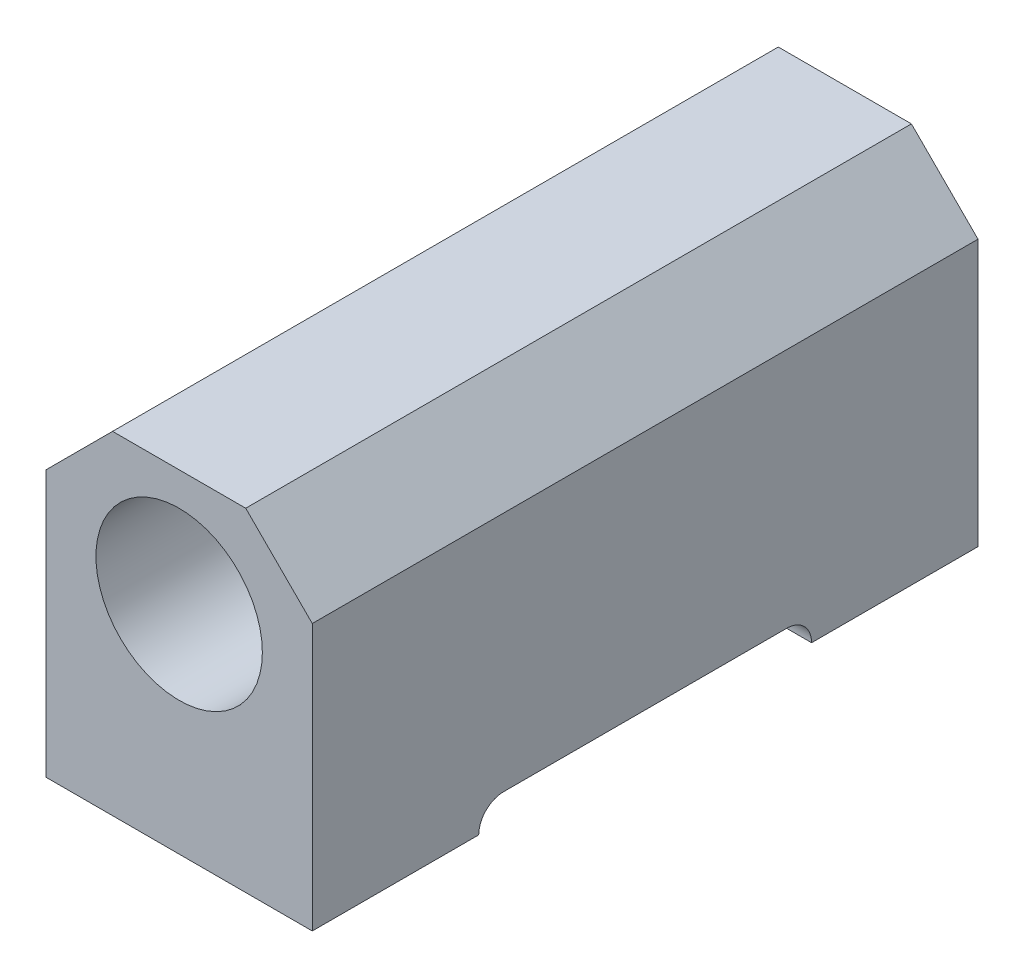
ISO-10303-21;
HEADER;
FILE_DESCRIPTION(('STEP AP214'),'2;1');
FILE_NAME('part.step','',(''),(''),'','','');
FILE_SCHEMA(('AUTOMOTIVE_DESIGN { 1 0 10303 214 1 1 1 1 }'));
ENDSEC;
DATA;
#1=APPLICATION_CONTEXT('core data for automotive mechanical design processes');
#2=APPLICATION_PROTOCOL_DEFINITION('international standard','automotive_design',2000,#1);
#3=PRODUCT_CONTEXT('',#1,'mechanical');
#4=PRODUCT('Part','Part','',(#3));
#5=PRODUCT_RELATED_PRODUCT_CATEGORY('part','',(#4));
#6=PRODUCT_DEFINITION_FORMATION('','',#4);
#7=PRODUCT_DEFINITION_CONTEXT('part definition',#1,'design');
#8=PRODUCT_DEFINITION('design','',#6,#7);
#9=PRODUCT_DEFINITION_SHAPE('','',#8);
#10=(LENGTH_UNIT() NAMED_UNIT(*) SI_UNIT(.MILLI.,.METRE.));
#11=(NAMED_UNIT(*) PLANE_ANGLE_UNIT() SI_UNIT($,.RADIAN.));
#12=(NAMED_UNIT(*) SI_UNIT($,.STERADIAN.) SOLID_ANGLE_UNIT());
#13=UNCERTAINTY_MEASURE_WITH_UNIT(LENGTH_MEASURE(1.E-05),#10,'distance_accuracy_value','');
#14=(GEOMETRIC_REPRESENTATION_CONTEXT(3) GLOBAL_UNCERTAINTY_ASSIGNED_CONTEXT((#13)) GLOBAL_UNIT_ASSIGNED_CONTEXT((#10,
#11,#12)) REPRESENTATION_CONTEXT('',''));
#15=CARTESIAN_POINT('',(0.,0.,0.));
#16=DIRECTION('',(0.,0.,1.));
#17=DIRECTION('',(1.,0.,0.));
#18=AXIS2_PLACEMENT_3D('',#15,#16,#17);
#19=CARTESIAN_POINT('',(-16.,0.,80.));
#20=DIRECTION('',(0.,1.,0.));
#21=DIRECTION('',(0.,0.,1.));
#22=AXIS2_PLACEMENT_3D('',#19,#20,#21);
#23=PLANE('',#22);
#24=DIRECTION('',(0.,0.,-1.));
#25=VECTOR('',#24,1.);
#26=CARTESIAN_POINT('',(-16.,0.,80.));
#27=LINE('',#26,#25);
#28=CARTESIAN_POINT('',(-16.,0.,80.));
#29=VERTEX_POINT('',#28);
#30=CARTESIAN_POINT('',(-16.,0.,60.));
#31=VERTEX_POINT('',#30);
#32=EDGE_CURVE('E11',#29,#31,#27,.T.);
#33=ORIENTED_EDGE('',*,*,#32,.T.);
#34=DIRECTION('',(1.,0.,0.));
#35=VECTOR('',#34,1.);
#36=CARTESIAN_POINT('',(-16.,0.,60.));
#37=LINE('',#36,#35);
#38=CARTESIAN_POINT('',(16.,0.,60.));
#39=VERTEX_POINT('',#38);
#40=EDGE_CURVE('E147',#31,#39,#37,.T.);
#41=ORIENTED_EDGE('',*,*,#40,.T.);
#42=DIRECTION('',(0.,0.,-1.));
#43=VECTOR('',#42,1.);
#44=CARTESIAN_POINT('',(16.,0.,80.));
#45=LINE('',#44,#43);
#46=CARTESIAN_POINT('',(16.,0.,80.));
#47=VERTEX_POINT('',#46);
#48=EDGE_CURVE('E194',#47,#39,#45,.T.);
#49=ORIENTED_EDGE('',*,*,#48,.F.);
#50=DIRECTION('',(1.,0.,0.));
#51=VECTOR('',#50,1.);
#52=CARTESIAN_POINT('',(-16.,0.,80.));
#53=LINE('',#52,#51);
#54=EDGE_CURVE('E159',#29,#47,#53,.T.);
#55=ORIENTED_EDGE('',*,*,#54,.F.);
#56=EDGE_LOOP('',(#33,#41,#49,#55));
#57=FACE_BOUND('',#56,.T.);
#58=ADVANCED_FACE('F33',(#57),#23,.F.);
#59=CARTESIAN_POINT('',(-16.,32.,80.));
#60=DIRECTION('',(1.,0.,0.));
#61=DIRECTION('',(0.,0.,-1.));
#62=AXIS2_PLACEMENT_3D('',#59,#60,#61);
#63=PLANE('',#62);
#64=DIRECTION('',(0.,0.,1.));
#65=VECTOR('',#64,1.);
#66=CARTESIAN_POINT('',(-16.,3.,57.));
#67=LINE('',#66,#65);
#68=CARTESIAN_POINT('',(-16.,3.,23.));
#69=VERTEX_POINT('',#68);
#70=CARTESIAN_POINT('',(-16.,3.,57.));
#71=VERTEX_POINT('',#70);
#72=EDGE_CURVE('E137',#69,#71,#67,.T.);
#73=ORIENTED_EDGE('',*,*,#72,.T.);
#74=CARTESIAN_POINT('',(-16.,0.,57.));
#75=DIRECTION('',(1.,0.,0.));
#76=DIRECTION('',(0.,0.,1.));
#77=AXIS2_PLACEMENT_3D('',#74,#75,#76);
#78=CIRCLE('',#77,3.);
#79=EDGE_CURVE('E141',#71,#31,#78,.T.);
#80=ORIENTED_EDGE('',*,*,#79,.T.);
#81=ORIENTED_EDGE('',*,*,#32,.F.);
#82=DIRECTION('',(0.,-1.,0.));
#83=VECTOR('',#82,1.);
#84=CARTESIAN_POINT('',(-16.,32.,80.));
#85=LINE('',#84,#83);
#86=CARTESIAN_POINT('',(-16.,32.,80.));
#87=VERTEX_POINT('',#86);
#88=EDGE_CURVE('E156',#87,#29,#85,.T.);
#89=ORIENTED_EDGE('',*,*,#88,.F.);
#90=DIRECTION('',(0.,0.,-1.));
#91=VECTOR('',#90,1.);
#92=CARTESIAN_POINT('',(-16.,32.,80.));
#93=LINE('',#92,#91);
#94=CARTESIAN_POINT('',(-16.,32.,0.));
#95=VERTEX_POINT('',#94);
#96=EDGE_CURVE('E170',#87,#95,#93,.T.);
#97=ORIENTED_EDGE('',*,*,#96,.T.);
#98=DIRECTION('',(0.,-1.,0.));
#99=VECTOR('',#98,1.);
#100=CARTESIAN_POINT('',(-16.,32.,0.));
#101=LINE('',#100,#99);
#102=CARTESIAN_POINT('',(-16.,0.,0.));
#103=VERTEX_POINT('',#102);
#104=EDGE_CURVE('E150',#95,#103,#101,.T.);
#105=ORIENTED_EDGE('',*,*,#104,.T.);
#106=CARTESIAN_POINT('',(-16.,0.,20.));
#107=VERTEX_POINT('',#106);
#108=EDGE_CURVE('E41',#107,#103,#27,.T.);
#109=ORIENTED_EDGE('',*,*,#108,.F.);
#110=CARTESIAN_POINT('',(-16.,0.,23.));
#111=DIRECTION('',(1.,0.,0.));
#112=DIRECTION('',(0.,0.,-1.));
#113=AXIS2_PLACEMENT_3D('',#110,#111,#112);
#114=CIRCLE('',#113,3.);
#115=EDGE_CURVE('E134',#107,#69,#114,.T.);
#116=ORIENTED_EDGE('',*,*,#115,.T.);
#117=EDGE_LOOP('',(#73,#80,#81,#89,#97,#105,#109,#116));
#118=FACE_BOUND('',#117,.T.);
#119=ADVANCED_FACE('F35',(#118),#63,.F.);
#120=CARTESIAN_POINT('',(0.,0.,10.));
#121=DIRECTION('',(0.,-1.,0.));
#122=DIRECTION('',(0.,0.,-1.));
#123=AXIS2_PLACEMENT_3D('',#120,#121,#122);
#124=CIRCLE('',#123,2.);
#125=CARTESIAN_POINT('',(0.,0.,8.));
#126=VERTEX_POINT('',#125);
#127=EDGE_CURVE('E257',#126,#126,#124,.T.);
#128=ORIENTED_EDGE('',*,*,#127,.F.);
#129=EDGE_LOOP('',(#128));
#130=FACE_BOUND('',#129,.T.);
#131=CARTESIAN_POINT('',(16.,0.,20.));
#132=VERTEX_POINT('',#131);
#133=CARTESIAN_POINT('',(16.,0.,0.));
#134=VERTEX_POINT('',#133);
#135=EDGE_CURVE('E193',#132,#134,#45,.T.);
#136=ORIENTED_EDGE('',*,*,#135,.F.);
#137=DIRECTION('',(1.,0.,0.));
#138=VECTOR('',#137,1.);
#139=CARTESIAN_POINT('',(-16.,0.,20.));
#140=LINE('',#139,#138);
#141=EDGE_CURVE('E53',#107,#132,#140,.T.);
#142=ORIENTED_EDGE('',*,*,#141,.F.);
#143=ORIENTED_EDGE('',*,*,#108,.T.);
#144=DIRECTION('',(1.,0.,0.));
#145=VECTOR('',#144,1.);
#146=CARTESIAN_POINT('',(-16.,0.,0.));
#147=LINE('',#146,#145);
#148=EDGE_CURVE('E173',#103,#134,#147,.T.);
#149=ORIENTED_EDGE('',*,*,#148,.T.);
#150=EDGE_LOOP('',(#136,#142,#143,#149));
#151=FACE_BOUND('',#150,.T.);
#152=ADVANCED_FACE('F207',(#130,#151),#23,.F.);
#153=CARTESIAN_POINT('',(16.,0.,80.));
#154=DIRECTION('',(-1.,0.,0.));
#155=DIRECTION('',(0.,0.,1.));
#156=AXIS2_PLACEMENT_3D('',#153,#154,#155);
#157=PLANE('',#156);
#158=ORIENTED_EDGE('',*,*,#48,.T.);
#159=CARTESIAN_POINT('',(16.,0.,57.));
#160=DIRECTION('',(1.,0.,0.));
#161=DIRECTION('',(0.,0.,1.));
#162=AXIS2_PLACEMENT_3D('',#159,#160,#161);
#163=CIRCLE('',#162,3.);
#164=CARTESIAN_POINT('',(16.,3.,57.));
#165=VERTEX_POINT('',#164);
#166=EDGE_CURVE('E138',#165,#39,#163,.T.);
#167=ORIENTED_EDGE('',*,*,#166,.F.);
#168=DIRECTION('',(0.,0.,1.));
#169=VECTOR('',#168,1.);
#170=CARTESIAN_POINT('',(16.,3.,57.));
#171=LINE('',#170,#169);
#172=CARTESIAN_POINT('',(16.,3.,23.));
#173=VERTEX_POINT('',#172);
#174=EDGE_CURVE('E127',#173,#165,#171,.T.);
#175=ORIENTED_EDGE('',*,*,#174,.F.);
#176=CARTESIAN_POINT('',(16.,0.,23.));
#177=DIRECTION('',(1.,0.,0.));
#178=DIRECTION('',(0.,0.,-1.));
#179=AXIS2_PLACEMENT_3D('',#176,#177,#178);
#180=CIRCLE('',#179,3.);
#181=EDGE_CURVE('E124',#132,#173,#180,.T.);
#182=ORIENTED_EDGE('',*,*,#181,.F.);
#183=ORIENTED_EDGE('',*,*,#135,.T.);
#184=DIRECTION('',(0.,1.,0.));
#185=VECTOR('',#184,1.);
#186=CARTESIAN_POINT('',(16.,0.,0.));
#187=LINE('',#186,#185);
#188=CARTESIAN_POINT('',(16.,32.,0.));
#189=VERTEX_POINT('',#188);
#190=EDGE_CURVE('E176',#134,#189,#187,.T.);
#191=ORIENTED_EDGE('',*,*,#190,.T.);
#192=DIRECTION('',(0.,0.,-1.));
#193=VECTOR('',#192,1.);
#194=CARTESIAN_POINT('',(16.,32.,80.));
#195=LINE('',#194,#193);
#196=CARTESIAN_POINT('',(16.,32.,80.));
#197=VERTEX_POINT('',#196);
#198=EDGE_CURVE('E191',#197,#189,#195,.T.);
#199=ORIENTED_EDGE('',*,*,#198,.F.);
#200=DIRECTION('',(0.,1.,0.));
#201=VECTOR('',#200,1.);
#202=CARTESIAN_POINT('',(16.,0.,80.));
#203=LINE('',#202,#201);
#204=EDGE_CURVE('E162',#47,#197,#203,.T.);
#205=ORIENTED_EDGE('',*,*,#204,.F.);
#206=EDGE_LOOP('',(#158,#167,#175,#182,#183,#191,#199,#205));
#207=FACE_BOUND('',#206,.T.);
#208=ADVANCED_FACE('F201',(#207),#157,.F.);
#209=CARTESIAN_POINT('',(16.,32.,80.));
#210=DIRECTION('',(-0.707106781186549,-0.707106781186546,0.));
#211=DIRECTION('',(0.707106781186546,-0.707106781186549,0.));
#212=AXIS2_PLACEMENT_3D('',#209,#210,#211);
#213=PLANE('',#212);
#214=DIRECTION('',(-0.707106781186546,0.707106781186549,0.));
#215=VECTOR('',#214,1.);
#216=CARTESIAN_POINT('',(16.,32.,0.));
#217=LINE('',#216,#215);
#218=CARTESIAN_POINT('',(8.00000000000003,40.,0.));
#219=VERTEX_POINT('',#218);
#220=EDGE_CURVE('E178',#189,#219,#217,.T.);
#221=ORIENTED_EDGE('',*,*,#220,.T.);
#222=DIRECTION('',(0.,0.,-1.));
#223=VECTOR('',#222,1.);
#224=CARTESIAN_POINT('',(8.00000000000003,40.,80.));
#225=LINE('',#224,#223);
#226=CARTESIAN_POINT('',(8.00000000000003,40.,80.));
#227=VERTEX_POINT('',#226);
#228=EDGE_CURVE('E188',#227,#219,#225,.T.);
#229=ORIENTED_EDGE('',*,*,#228,.F.);
#230=DIRECTION('',(-0.707106781186546,0.707106781186549,0.));
#231=VECTOR('',#230,1.);
#232=CARTESIAN_POINT('',(16.,32.,80.));
#233=LINE('',#232,#231);
#234=EDGE_CURVE('E164',#197,#227,#233,.T.);
#235=ORIENTED_EDGE('',*,*,#234,.F.);
#236=ORIENTED_EDGE('',*,*,#198,.T.);
#237=EDGE_LOOP('',(#221,#229,#235,#236));
#238=FACE_BOUND('',#237,.T.);
#239=ADVANCED_FACE('F217',(#238),#213,.F.);
#240=CARTESIAN_POINT('',(8.00000000000003,40.,80.));
#241=DIRECTION('',(0.,-1.,0.));
#242=DIRECTION('',(0.,0.,-1.));
#243=AXIS2_PLACEMENT_3D('',#240,#241,#242);
#244=PLANE('',#243);
#245=DIRECTION('',(-1.,0.,0.));
#246=VECTOR('',#245,1.);
#247=CARTESIAN_POINT('',(8.00000000000003,40.,0.));
#248=LINE('',#247,#246);
#249=CARTESIAN_POINT('',(-7.99999999999997,40.,0.));
#250=VERTEX_POINT('',#249);
#251=EDGE_CURVE('E180',#219,#250,#248,.T.);
#252=ORIENTED_EDGE('',*,*,#251,.T.);
#253=DIRECTION('',(0.,0.,-1.));
#254=VECTOR('',#253,1.);
#255=CARTESIAN_POINT('',(-7.99999999999997,40.,80.));
#256=LINE('',#255,#254);
#257=CARTESIAN_POINT('',(-7.99999999999997,40.,80.));
#258=VERTEX_POINT('',#257);
#259=EDGE_CURVE('E185',#258,#250,#256,.T.);
#260=ORIENTED_EDGE('',*,*,#259,.F.);
#261=DIRECTION('',(-1.,0.,0.));
#262=VECTOR('',#261,1.);
#263=CARTESIAN_POINT('',(8.00000000000003,40.,80.));
#264=LINE('',#263,#262);
#265=EDGE_CURVE('E166',#227,#258,#264,.T.);
#266=ORIENTED_EDGE('',*,*,#265,.F.);
#267=ORIENTED_EDGE('',*,*,#228,.T.);
#268=EDGE_LOOP('',(#252,#260,#266,#267));
#269=FACE_BOUND('',#268,.T.);
#270=ADVANCED_FACE('F221',(#269),#244,.F.);
#271=CARTESIAN_POINT('',(-7.99999999999997,40.,80.));
#272=DIRECTION('',(0.707106781186546,-0.707106781186549,0.));
#273=DIRECTION('',(0.707106781186549,0.707106781186546,0.));
#274=AXIS2_PLACEMENT_3D('',#271,#272,#273);
#275=PLANE('',#274);
#276=DIRECTION('',(-0.707106781186549,-0.707106781186546,0.));
#277=VECTOR('',#276,1.);
#278=CARTESIAN_POINT('',(-7.99999999999997,40.,0.));
#279=LINE('',#278,#277);
#280=EDGE_CURVE('E160',#250,#95,#279,.T.);
#281=ORIENTED_EDGE('',*,*,#280,.T.);
#282=ORIENTED_EDGE('',*,*,#96,.F.);
#283=DIRECTION('',(-0.707106781186549,-0.707106781186546,0.));
#284=VECTOR('',#283,1.);
#285=CARTESIAN_POINT('',(-7.99999999999997,40.,80.));
#286=LINE('',#285,#284);
#287=EDGE_CURVE('E168',#258,#87,#286,.T.);
#288=ORIENTED_EDGE('',*,*,#287,.F.);
#289=ORIENTED_EDGE('',*,*,#259,.T.);
#290=EDGE_LOOP('',(#281,#282,#288,#289));
#291=FACE_BOUND('',#290,.T.);
#292=ADVANCED_FACE('F296',(#291),#275,.F.);
#293=CARTESIAN_POINT('',(-16.,0.,80.));
#294=DIRECTION('',(0.,0.,1.));
#295=DIRECTION('',(1.,0.,0.));
#296=AXIS2_PLACEMENT_3D('',#293,#294,#295);
#297=PLANE('',#296);
#298=CARTESIAN_POINT('',(0.,26.,80.));
#299=DIRECTION('',(0.,0.,1.));
#300=DIRECTION('',(1.,0.,0.));
#301=AXIS2_PLACEMENT_3D('',#298,#299,#300);
#302=CIRCLE('',#301,9.99999999999999);
#303=CARTESIAN_POINT('',(9.99999999999999,26.,80.));
#304=VERTEX_POINT('',#303);
#305=EDGE_CURVE('E125',#304,#304,#302,.T.);
#306=ORIENTED_EDGE('',*,*,#305,.F.);
#307=EDGE_LOOP('',(#306));
#308=FACE_BOUND('',#307,.T.);
#309=ORIENTED_EDGE('',*,*,#88,.T.);
#310=ORIENTED_EDGE('',*,*,#54,.T.);
#311=ORIENTED_EDGE('',*,*,#204,.T.);
#312=ORIENTED_EDGE('',*,*,#234,.T.);
#313=ORIENTED_EDGE('',*,*,#265,.T.);
#314=ORIENTED_EDGE('',*,*,#287,.T.);
#315=EDGE_LOOP('',(#309,#310,#311,#312,#313,#314));
#316=FACE_BOUND('',#315,.T.);
#317=ADVANCED_FACE('F225',(#308,#316),#297,.T.);
#318=CARTESIAN_POINT('',(-16.,0.,0.));
#319=DIRECTION('',(0.,0.,1.));
#320=DIRECTION('',(1.,0.,0.));
#321=AXIS2_PLACEMENT_3D('',#318,#319,#320);
#322=PLANE('',#321);
#323=ORIENTED_EDGE('',*,*,#104,.F.);
#324=ORIENTED_EDGE('',*,*,#280,.F.);
#325=ORIENTED_EDGE('',*,*,#251,.F.);
#326=ORIENTED_EDGE('',*,*,#220,.F.);
#327=ORIENTED_EDGE('',*,*,#190,.F.);
#328=ORIENTED_EDGE('',*,*,#148,.F.);
#329=EDGE_LOOP('',(#323,#324,#325,#326,#327,#328));
#330=FACE_BOUND('',#329,.T.);
#331=ADVANCED_FACE('F212',(#330),#322,.F.);
#332=CARTESIAN_POINT('',(-16.,0.,57.));
#333=DIRECTION('',(1.,0.,0.));
#334=DIRECTION('',(0.,0.,-1.));
#335=AXIS2_PLACEMENT_3D('',#332,#333,#334);
#336=CYLINDRICAL_SURFACE('',#335,3.);
#337=ORIENTED_EDGE('',*,*,#166,.T.);
#338=ORIENTED_EDGE('',*,*,#40,.F.);
#339=ORIENTED_EDGE('',*,*,#79,.F.);
#340=DIRECTION('',(1.,0.,0.));
#341=VECTOR('',#340,1.);
#342=CARTESIAN_POINT('',(-16.,3.,57.));
#343=LINE('',#342,#341);
#344=EDGE_CURVE('E151',#71,#165,#343,.T.);
#345=ORIENTED_EDGE('',*,*,#344,.T.);
#346=EDGE_LOOP('',(#337,#338,#339,#345));
#347=FACE_BOUND('',#346,.T.);
#348=ADVANCED_FACE('F232',(#347),#336,.F.);
#349=CARTESIAN_POINT('',(-16.,3.,57.));
#350=DIRECTION('',(0.,1.,0.));
#351=DIRECTION('',(0.,0.,1.));
#352=AXIS2_PLACEMENT_3D('',#349,#350,#351);
#353=PLANE('',#352);
#354=CARTESIAN_POINT('',(0.,3.,40.));
#355=DIRECTION('',(0.,-1.,0.));
#356=DIRECTION('',(0.,0.,-1.));
#357=AXIS2_PLACEMENT_3D('',#354,#355,#356);
#358=CIRCLE('',#357,5.);
#359=CARTESIAN_POINT('',(0.,3.,35.));
#360=VERTEX_POINT('',#359);
#361=EDGE_CURVE('E130',#360,#360,#358,.T.);
#362=ORIENTED_EDGE('',*,*,#361,.F.);
#363=EDGE_LOOP('',(#362));
#364=FACE_BOUND('',#363,.T.);
#365=ORIENTED_EDGE('',*,*,#174,.T.);
#366=ORIENTED_EDGE('',*,*,#344,.F.);
#367=ORIENTED_EDGE('',*,*,#72,.F.);
#368=DIRECTION('',(1.,0.,0.));
#369=VECTOR('',#368,1.);
#370=CARTESIAN_POINT('',(-16.,3.,23.));
#371=LINE('',#370,#369);
#372=EDGE_CURVE('E153',#69,#173,#371,.T.);
#373=ORIENTED_EDGE('',*,*,#372,.T.);
#374=EDGE_LOOP('',(#365,#366,#367,#373));
#375=FACE_BOUND('',#374,.T.);
#376=ADVANCED_FACE('F236',(#364,#375),#353,.F.);
#377=CARTESIAN_POINT('',(-16.,0.,23.));
#378=DIRECTION('',(1.,0.,0.));
#379=DIRECTION('',(0.,0.,-1.));
#380=AXIS2_PLACEMENT_3D('',#377,#378,#379);
#381=CYLINDRICAL_SURFACE('',#380,3.);
#382=ORIENTED_EDGE('',*,*,#181,.T.);
#383=ORIENTED_EDGE('',*,*,#372,.F.);
#384=ORIENTED_EDGE('',*,*,#115,.F.);
#385=ORIENTED_EDGE('',*,*,#141,.T.);
#386=EDGE_LOOP('',(#382,#383,#384,#385));
#387=FACE_BOUND('',#386,.T.);
#388=ADVANCED_FACE('F118',(#387),#381,.F.);
#389=CARTESIAN_POINT('',(0.,26.,7.99999999999999));
#390=DIRECTION('',(0.,0.,1.));
#391=DIRECTION('',(1.,0.,0.));
#392=AXIS2_PLACEMENT_3D('',#389,#390,#391);
#393=CONICAL_SURFACE('',#392,9.99999999999998,1.0471975511966);
#394=CARTESIAN_POINT('',(0.,26.,2.22649730810373));
#395=VERTEX_POINT('',#394);
#396=VERTEX_LOOP('',#395);
#397=FACE_BOUND('',#396,.T.);
#398=CARTESIAN_POINT('',(0.,26.,7.99999999999999));
#399=DIRECTION('',(0.,0.,1.));
#400=DIRECTION('',(1.,0.,0.));
#401=AXIS2_PLACEMENT_3D('',#398,#399,#400);
#402=CIRCLE('',#401,9.99999999999998);
#403=CARTESIAN_POINT('',(0.,16.,7.99999999999999));
#404=VERTEX_POINT('',#403);
#405=EDGE_CURVE('E122',#404,#404,#402,.T.);
#406=ORIENTED_EDGE('',*,*,#405,.T.);
#407=EDGE_LOOP('',(#406));
#408=FACE_BOUND('',#407,.T.);
#409=ADVANCED_FACE('F114',(#397,#408),#393,.F.);
#410=CARTESIAN_POINT('',(0.,26.,80.));
#411=DIRECTION('',(0.,0.,1.));
#412=DIRECTION('',(1.,0.,0.));
#413=AXIS2_PLACEMENT_3D('',#410,#411,#412);
#414=CYLINDRICAL_SURFACE('',#413,9.99999999999999);
#415=CARTESIAN_POINT('',(0.,16.,35.));
#416=CARTESIAN_POINT('',(-0.131488890078729,16.0000003982812,35.000000432216));
#417=CARTESIAN_POINT('',(-0.262986970217152,16.0025994687872,35.0051927752851));
#418=CARTESIAN_POINT('',(-0.525014586348057,16.0129302216483,35.025902894112));
#419=CARTESIAN_POINT('',(-0.655543676003295,16.0206641368507,35.041425161764));
#420=CARTESIAN_POINT('',(-0.914783203431133,16.04107933031,35.0826407794773));
#421=CARTESIAN_POINT('',(-1.04349077535257,16.0537676635712,35.1083486344062));
#422=CARTESIAN_POINT('',(-1.29802636754293,16.0837728342333,35.1696506725635));
#423=CARTESIAN_POINT('',(-1.42385318781692,16.1010915636962,35.2052488974056));
#424=CARTESIAN_POINT('',(-1.67121386584967,16.139845698452,35.2857784824513));
#425=CARTESIAN_POINT('',(-1.79276399094561,16.1612629032924,35.330668648548));
#426=CARTESIAN_POINT('',(-2.0314444775119,16.2077557251068,35.4294487978069));
#427=CARTESIAN_POINT('',(-2.14857315511665,16.2328327185316,35.4833421681934));
#428=CARTESIAN_POINT('',(-2.49222561412914,16.3126913951127,35.657799628939));
#429=CARTESIAN_POINT('',(-2.71128846115304,16.3721453978383,35.7912307732401));
#430=CARTESIAN_POINT('',(-3.13758045755123,16.5021933657584,36.0976052812446));
#431=CARTESIAN_POINT('',(-3.34329192972867,16.5732436732865,36.2724506902797));
#432=CARTESIAN_POINT('',(-3.72388133818108,16.7169978552475,36.6525890882832));
#433=CARTESIAN_POINT('',(-3.89873577832562,16.7897029425646,36.8579050619838));
#434=CARTESIAN_POINT('',(-4.22628385620054,16.9350613266701,37.3124751474643));
#435=CARTESIAN_POINT('',(-4.37620734766694,17.007273358297,37.5639018913175));
#436=CARTESIAN_POINT('',(-4.56723365243868,17.1036258245332,37.9599180443676));
#437=CARTESIAN_POINT('',(-4.62527981130997,17.1337572031528,38.0951182905603));
#438=CARTESIAN_POINT('',(-4.72948843578257,17.1889038837278,38.3710012517741));
#439=CARTESIAN_POINT('',(-4.77565793744269,17.2139222129804,38.5116806636392));
#440=CARTESIAN_POINT('',(-4.8531380584616,17.2564943763794,38.788992754156));
#441=CARTESIAN_POINT('',(-4.88516762296958,17.2744029589113,38.9253704799779));
#442=CARTESIAN_POINT('',(-4.93772573892406,17.304036662889,39.2009256974796));
#443=CARTESIAN_POINT('',(-4.95826039236648,17.3157650648476,39.3401016630061));
#444=CARTESIAN_POINT('',(-4.98752398958936,17.3325383891299,39.6200074611112));
#445=CARTESIAN_POINT('',(-4.99626004329765,17.3375873365071,39.7607363063141));
#446=CARTESIAN_POINT('',(-5.00180399494055,17.3407870036106,40.0425011762896));
#447=CARTESIAN_POINT('',(-4.99861303092504,17.3389383814877,40.1835371704714));
#448=CARTESIAN_POINT('',(-4.98145803092846,17.3290627282641,40.4477035728769));
#449=CARTESIAN_POINT('',(-4.96883208371091,17.3218033649887,40.5709526028102));
#450=CARTESIAN_POINT('',(-4.93454402662215,17.3022609300338,40.8158212139671));
#451=CARTESIAN_POINT('',(-4.91287907868334,17.2899762805373,40.9374402710219));
#452=CARTESIAN_POINT('',(-4.86076278292654,17.2607852042305,41.1781978743128));
#453=CARTESIAN_POINT('',(-4.83031251988904,17.2438793480444,41.29733672485));
#454=CARTESIAN_POINT('',(-4.76094319159974,17.205969260154,41.5324713769544));
#455=CARTESIAN_POINT('',(-4.72202079856857,17.1849634183466,41.6484659232761));
#456=CARTESIAN_POINT('',(-4.59108661358502,17.1156396757836,41.9960068716186));
#457=CARTESIAN_POINT('',(-4.48608785825887,17.0617120816648,42.2216933560378));
#458=CARTESIAN_POINT('',(-4.24519591002764,16.944825669214,42.6532101182229));
#459=CARTESIAN_POINT('',(-4.10928884013355,16.8818627989897,42.8590314177592));
#460=CARTESIAN_POINT('',(-3.79034422310328,16.7443454424092,43.2725885282038));
#461=CARTESIAN_POINT('',(-3.60351571642877,16.6693334579687,43.4772580077073));
#462=CARTESIAN_POINT('',(-3.19773444843253,16.5226098608995,43.8537034656887));
#463=CARTESIAN_POINT('',(-2.97876642220598,16.450899837942,44.0254637238212));
#464=CARTESIAN_POINT('',(-2.62430600098781,16.3496549341778,44.2584408971132));
#465=CARTESIAN_POINT('',(-2.49871002336159,16.3162961972575,44.3333520951455));
#466=CARTESIAN_POINT('',(-2.2407106014256,16.2533694728153,44.4722082029724));
#467=CARTESIAN_POINT('',(-2.1083100575541,16.2237998886422,44.5361577355911));
#468=CARTESIAN_POINT('',(-1.83762803314804,16.1693244648946,44.6523988753834));
#469=CARTESIAN_POINT('',(-1.69934894682179,16.1444167485506,44.7046951755248));
#470=CARTESIAN_POINT('',(-1.41791187896084,16.100009735425,44.79702492908));
#471=CARTESIAN_POINT('',(-1.27475446078988,16.0805098164962,44.8370597931822));
#472=CARTESIAN_POINT('',(-0.996798015430415,16.0489040267181,44.901533563503));
#473=CARTESIAN_POINT('',(-0.8622886740298,16.0363195366568,44.9269895154024));
#474=CARTESIAN_POINT('',(-0.591248360012469,16.0165696426773,44.9668080412236));
#475=CARTESIAN_POINT('',(-0.454717567193955,16.009403759718,44.9811715957901));
#476=CARTESIAN_POINT('',(-0.18081070935965,16.0006961951265,44.9986131620341));
#477=CARTESIAN_POINT('',(-0.0434349881359027,15.999152360327,45.0016954942669));
#478=CARTESIAN_POINT('',(0.231047608581548,16.0017276214096,44.9965444260812));
#479=CARTESIAN_POINT('',(0.368154495704336,16.0058464666736,44.9883115264507));
#480=CARTESIAN_POINT('',(0.630324023952242,16.0190902691756,44.961721326159));
#481=CARTESIAN_POINT('',(0.755493751243216,16.027800777569,44.9442016224066));
#482=CARTESIAN_POINT('',(1.00380426086804,16.0497277264728,44.8998255264294));
#483=CARTESIAN_POINT('',(1.12694438760008,16.0629455941642,44.8729661769068));
#484=CARTESIAN_POINT('',(1.37032307172125,16.0935754959589,44.8101973166375));
#485=CARTESIAN_POINT('',(1.49056250470176,16.1109862465373,44.7742905753219));
#486=CARTESIAN_POINT('',(1.72747946867538,16.1496063185113,44.6937718386768));
#487=CARTESIAN_POINT('',(1.84415561535681,16.1708170947593,44.6491565086473));
#488=CARTESIAN_POINT('',(2.19430354472275,16.2407712358342,44.5000521931497));
#489=CARTESIAN_POINT('',(2.42111320848944,16.2949509552182,44.3820592582149));
#490=CARTESIAN_POINT('',(2.8523456015808,16.4128062425441,44.1144478067803));
#491=CARTESIAN_POINT('',(3.05675873773467,16.4764858522362,43.9648158180077));
#492=CARTESIAN_POINT('',(3.45882132675025,16.614584946079,43.6212127089634));
#493=CARTESIAN_POINT('',(3.65383533419946,16.6894450063801,43.4243304082476));
#494=CARTESIAN_POINT('',(4.00930667677967,16.8368911824086,43.000329462866));
#495=CARTESIAN_POINT('',(4.16974010650665,16.9094756956267,42.7731900760017));
#496=CARTESIAN_POINT('',(4.38466016919211,17.0121473941738,42.4075094337707));
#497=CARTESIAN_POINT('',(4.4532676226712,17.0460404475862,42.2781491254565));
#498=CARTESIAN_POINT('',(4.57918112262684,17.1097764758492,42.013105899221));
#499=CARTESIAN_POINT('',(4.63649228788887,17.1396212831963,41.8774258796241));
#500=CARTESIAN_POINT('',(4.73913999074898,17.1940967263437,41.6007229646748));
#501=CARTESIAN_POINT('',(4.78448631442401,17.2187316200527,41.45970454425));
#502=CARTESIAN_POINT('',(4.86265004333096,17.2617718090184,41.1733089571752));
#503=CARTESIAN_POINT('',(4.89546938847111,17.2801780687815,41.0279324691725));
#504=CARTESIAN_POINT('',(4.94553834792943,17.3084872432861,40.7482350184647));
#505=CARTESIAN_POINT('',(4.96397997433445,17.3190367296474,40.6141921168801));
#506=CARTESIAN_POINT('',(4.98993873206133,17.3339317546042,40.3447147543026));
#507=CARTESIAN_POINT('',(4.99745700797003,17.3382779432022,40.2092804406048));
#508=CARTESIAN_POINT('',(5.00145477351748,17.3405857434327,39.9382430749954));
#509=CARTESIAN_POINT('',(4.99793814327599,17.3385495992365,39.8026400991504));
#510=CARTESIAN_POINT('',(4.97992974203946,17.3281831821418,39.5324144420521));
#511=CARTESIAN_POINT('',(4.96543842034336,17.3198531669117,39.3977917208955));
#512=CARTESIAN_POINT('',(4.92759757627216,17.298321712552,39.143439797841));
#513=CARTESIAN_POINT('',(4.90522766015,17.2856622909115,39.0235174403761));
#514=CARTESIAN_POINT('',(4.85194376743194,17.2558840051949,38.7861388094325));
#515=CARTESIAN_POINT('',(4.82102714868722,17.2387637621836,38.668683310666));
#516=CARTESIAN_POINT('',(4.71590306073959,17.1814576813128,38.3210828848871));
#517=CARTESIAN_POINT('',(4.62929708984156,17.1353118622887,38.095543905014));
#518=CARTESIAN_POINT('',(4.41907164675021,17.028571090454,37.6468396576875));
#519=CARTESIAN_POINT('',(4.29335633682032,16.9672136635261,37.4248519240106));
#520=CARTESIAN_POINT('',(4.01075421010745,16.8382336350478,37.0036358904043));
#521=CARTESIAN_POINT('',(3.85385117607732,16.7706077837955,36.8044195165558));
#522=CARTESIAN_POINT('',(3.49102748964406,16.6268855539921,36.4092921415293));
#523=CARTESIAN_POINT('',(3.28146736342599,16.5507583709409,36.2167239812324));
#524=CARTESIAN_POINT('',(2.83072875767415,16.4061048502847,35.8686655788167));
#525=CARTESIAN_POINT('',(2.58953334336126,16.3375826202396,35.7131953222564));
#526=CARTESIAN_POINT('',(2.20753881885374,16.2458098662417,35.5113695854732));
#527=CARTESIAN_POINT('',(2.07625512570271,16.2169579001971,35.4491329205936));
#528=CARTESIAN_POINT('',(1.80799529933999,16.1638525476545,35.3360638438796));
#529=CARTESIAN_POINT('',(1.67102200205152,16.1395969029203,35.2852258294694));
#530=CARTESIAN_POINT('',(1.39269501068688,16.0964551587128,35.1956545616328));
#531=CARTESIAN_POINT('',(1.25135162347081,16.0775573562062,35.1568949070123));
#532=CARTESIAN_POINT('',(0.965237205795558,16.0456538188799,35.0918624037314));
#533=CARTESIAN_POINT('',(0.820468326048375,16.0326444851033,35.065581927473));
#534=CARTESIAN_POINT('',(0.563041654408161,16.0152361212128,35.0305254680011));
#535=CARTESIAN_POINT('',(0.450825809730025,16.0095325839834,35.019088246308));
#536=CARTESIAN_POINT('',(0.225742246050265,16.0019143001399,35.0038252217499));
#537=CARTESIAN_POINT('',(0.112874509142188,15.999999658102,34.9999996289712));
#538=CARTESIAN_POINT('',(0.,16.,35.));
#539=B_SPLINE_CURVE_WITH_KNOTS('',3,(#415,#416,#417,#418,#419,#420,#421,#422,#423,#424,#425,
#426,#427,#428,#429,#430,#431,#432,#433,#434,#435,#436,#437,#438,#439,#440,#441,#442,#443,#444,
#445,#446,#447,#448,#449,#450,#451,#452,#453,#454,#455,#456,#457,#458,#459,#460,#461,#462,#463,
#464,#465,#466,#467,#468,#469,#470,#471,#472,#473,#474,#475,#476,#477,#478,#479,#480,#481,#482,
#483,#484,#485,#486,#487,#488,#489,#490,#491,#492,#493,#494,#495,#496,#497,#498,#499,#500,#501,
#502,#503,#504,#505,#506,#507,#508,#509,#510,#511,#512,#513,#514,#515,#516,#517,#518,#519,#520,
#521,#522,#523,#524,#525,#526,#527,#528,#529,#530,#531,#532,#533,#534,#535,#536,#537,#538),
.UNSPECIFIED.,.T.,.F.,(4,2,2,2,2,2,2,2,2,2,2,2,2,2,2,2,2,2,2,2,2,2,2,2,2,2,2,2,2,2,2,2,2,2,2,2,
2,2,2,2,2,2,2,2,2,2,2,2,2,2,2,2,2,2,2,2,2,2,2,2,2,4),(0.,0.39435529464989,0.788882184037818,
1.18397293369034,1.57922537181693,1.97276168530542,2.36644639154631,3.15295441699266,
3.98704440767527,4.821766802355,5.72122193562246,6.17125359989459,6.62101803579306,
7.04410338623953,7.46696393118359,7.88956954321096,8.31213483216671,8.68401534897462,
9.0560127168917,9.42796417149685,9.8000619899096,10.56083380205,11.3219478566368,
12.1795688603196,13.03759852356,13.4870830845772,13.9363776171859,14.3854908824168,
14.8345524573652,15.2464230691107,15.6582572644723,16.0699337163998,16.4815919489941,
16.8612200640511,17.240968493866,17.6206008225791,18.0003788066131,18.7808755264614,
19.5617052624835,20.4192132572739,21.2773121558255,21.7277011924366,22.1778856687596,
22.6277007885002,23.0774462222894,23.4840267197959,23.8905646113036,24.2969595710184,
24.703337894006,25.0708552370355,25.4384863225851,26.1732662495599,26.9574126491567,
27.7419678673239,28.6218519479817,29.5022089791541,29.9460734671028,30.3897193096443,
30.8323885049027,31.2747867798493,31.6133053554877,31.9518332743451),.UNSPECIFIED.);
#540=CARTESIAN_POINT('',(0.,16.,35.));
#541=VERTEX_POINT('',#540);
#542=EDGE_CURVE('E259',#541,#541,#539,.T.);
#543=ORIENTED_EDGE('',*,*,#542,.F.);
#544=EDGE_LOOP('',(#543));
#545=FACE_BOUND('',#544,.T.);
#546=ORIENTED_EDGE('',*,*,#405,.F.);
#547=CARTESIAN_POINT('',(0.,16.,8.));
#548=CARTESIAN_POINT('',(-0.111153813585266,16.0000020483826,8.00000408899669));
#549=CARTESIAN_POINT('',(-0.222359320403044,16.0018722964354,8.00929768593529));
#550=CARTESIAN_POINT('',(-0.441627015378038,16.0091526875354,8.04619700023049));
#551=CARTESIAN_POINT('',(-0.549686635082711,16.0145656427963,8.07381726560302));
#552=CARTESIAN_POINT('',(-0.759460610526626,16.0283270144343,8.14648254724158));
#553=CARTESIAN_POINT('',(-0.861180935866268,16.0366726184656,8.19151087368937));
#554=CARTESIAN_POINT('',(-1.05561597772845,16.0553920392937,8.29766449502259));
#555=CARTESIAN_POINT('',(-1.14833123015162,16.0657657352859,8.35878883121441));
#556=CARTESIAN_POINT('',(-1.32338695462973,16.0875566934006,8.49627698858287));
#557=CARTESIAN_POINT('',(-1.40558790231705,16.0989850899131,8.5728167107824));
#558=CARTESIAN_POINT('',(-1.55607351321606,16.1215163909482,8.73858483278341));
#559=CARTESIAN_POINT('',(-1.62435708954085,16.1326192699915,8.82781422267024));
#560=CARTESIAN_POINT('',(-1.74566350669524,16.1533511637477,9.01743238602375));
#561=CARTESIAN_POINT('',(-1.79854187773173,16.1629658527011,9.11791528759272));
#562=CARTESIAN_POINT('',(-1.88661133316062,16.1794746388317,9.32656363800816));
#563=CARTESIAN_POINT('',(-1.92180416487448,16.1863690047608,9.43472832669269));
#564=CARTESIAN_POINT('',(-1.97305059976965,16.1965438949559,9.65416872781583));
#565=CARTESIAN_POINT('',(-1.98934899591755,16.1998705978563,9.76538508828445));
#566=CARTESIAN_POINT('',(-2.00310425545224,16.2026724987875,9.98901964272869));
#567=CARTESIAN_POINT('',(-2.000563045427,16.2021480906432,10.1014377126403));
#568=CARTESIAN_POINT('',(-1.97690914620364,16.1973489770363,10.322493576042));
#569=CARTESIAN_POINT('',(-1.95607708048781,16.1931309428247,10.4311628112546));
#570=CARTESIAN_POINT('',(-1.8968757692461,16.1815090768,10.643432153326));
#571=CARTESIAN_POINT('',(-1.85850568620136,16.1741050928444,10.747032017838));
#572=CARTESIAN_POINT('',(-1.76504956734944,16.1568876299919,10.9470305234072));
#573=CARTESIAN_POINT('',(-1.70985230246423,16.1470582037259,11.0433757591383));
#574=CARTESIAN_POINT('',(-1.58438714914536,16.1261076245388,11.2255416999456));
#575=CARTESIAN_POINT('',(-1.51411752871366,16.1149863232327,11.3113611937023));
#576=CARTESIAN_POINT('',(-1.35899986912117,16.0924595751708,11.4716588049139));
#577=CARTESIAN_POINT('',(-1.27391232242489,16.0810526157819,11.5459051357183));
#578=CARTESIAN_POINT('',(-1.09237004812402,16.0594230257118,11.6791076926024));
#579=CARTESIAN_POINT('',(-0.995915174758779,16.0492004102205,11.7380637225872));
#580=CARTESIAN_POINT('',(-0.794118773757843,16.0310661967823,11.8390550184519));
#581=CARTESIAN_POINT('',(-0.688763639170602,16.0231582230346,11.8810637872891));
#582=CARTESIAN_POINT('',(-0.472297952897332,16.0105718202428,11.9467209480771));
#583=CARTESIAN_POINT('',(-0.361188100144901,16.0058929999894,11.9703715641473));
#584=CARTESIAN_POINT('',(-0.138358811254302,16.0003465626627,11.9983129075886));
#585=CARTESIAN_POINT('',(-0.0266806566511537,15.9994165069506,12.0029208390805));
#586=CARTESIAN_POINT('',(0.195849868385427,16.001298961398,11.9935002821156));
#587=CARTESIAN_POINT('',(0.306702284887585,16.0041112611711,11.9794728412948));
#588=CARTESIAN_POINT('',(0.523411319893081,16.0131233598397,11.9334432529121));
#589=CARTESIAN_POINT('',(0.629303896679805,16.0192924719159,11.9016038630042));
#590=CARTESIAN_POINT('',(0.834247254999333,16.0343289587794,11.8210320346884));
#591=CARTESIAN_POINT('',(0.933297523275078,16.0431965357155,11.7722983306463));
#592=CARTESIAN_POINT('',(1.12308234737243,16.0628017693341,11.6586350186974));
#593=CARTESIAN_POINT('',(1.21370025350437,16.073560991259,11.5935144379221));
#594=CARTESIAN_POINT('',(1.38283603823841,16.0957053034024,11.4491816175854));
#595=CARTESIAN_POINT('',(1.46135261786152,16.1070904606323,11.3699678672003));
#596=CARTESIAN_POINT('',(1.60528118154835,16.1294139288607,11.1982532962178));
#597=CARTESIAN_POINT('',(1.67047540489731,16.1403427953339,11.1055685115573));
#598=CARTESIAN_POINT('',(1.78437084010241,16.1603161640761,10.9103772772866));
#599=CARTESIAN_POINT('',(1.8330727118458,16.1693607417332,10.8078712208529));
#600=CARTESIAN_POINT('',(1.91230368316392,16.1844651883124,10.5964635077009));
#601=CARTESIAN_POINT('',(1.9429269995821,16.1905405025563,10.4875983175794));
#602=CARTESIAN_POINT('',(1.98541730325439,16.1990512641595,10.2661330930182));
#603=CARTESIAN_POINT('',(1.99728673645022,16.2014871861778,10.1535335475813));
#604=CARTESIAN_POINT('',(2.00184182173494,16.2024170073724,9.92998227091136));
#605=CARTESIAN_POINT('',(1.99487157614179,16.200981616214,9.81903770214598));
#606=CARTESIAN_POINT('',(1.96270460820012,16.1944885303077,9.59993670018995));
#607=CARTESIAN_POINT('',(1.9375080322586,16.1894308646566,9.49178024461039));
#608=CARTESIAN_POINT('',(1.86975713699791,16.1762947156168,9.28154457751891));
#609=CARTESIAN_POINT('',(1.82724501343469,16.1682235796234,9.17945127899517));
#610=CARTESIAN_POINT('',(1.72610928920321,16.1499657005166,8.98379255853112));
#611=CARTESIAN_POINT('',(1.66748433754977,16.1397787800221,8.89022785254973));
#612=CARTESIAN_POINT('',(1.53461182957283,16.1182207895355,8.71256885569938));
#613=CARTESIAN_POINT('',(1.46011577447036,16.106832541806,8.62866246946481));
#614=CARTESIAN_POINT('',(1.29812873802628,16.0842783625609,8.47442758894166));
#615=CARTESIAN_POINT('',(1.21063477430667,16.0731124827363,8.40410221936546));
#616=CARTESIAN_POINT('',(1.02403525817649,16.0521233522406,8.27833071210711));
#617=CARTESIAN_POINT('',(0.92481776885967,16.0423153756151,8.22304799343995));
#618=CARTESIAN_POINT('',(0.718332721881466,16.0252974983,8.13002775480682));
#619=CARTESIAN_POINT('',(0.611072521726253,16.0180852572277,8.09227442093502));
#620=CARTESIAN_POINT('',(0.419642977847559,16.0084725480926,8.04269610391057));
#621=CARTESIAN_POINT('',(0.336563328027569,16.005313936831,8.02671361258449));
#622=CARTESIAN_POINT('',(0.168999050420134,16.0010769172022,8.00536417528327));
#623=CARTESIAN_POINT('',(0.0845144674972379,15.9999984425369,7.99999689098046));
#624=CARTESIAN_POINT('',(0.,16.,8.));
#625=B_SPLINE_CURVE_WITH_KNOTS('',3,(#547,#548,#549,#550,#551,#552,#553,#554,#555,#556,#557,
#558,#559,#560,#561,#562,#563,#564,#565,#566,#567,#568,#569,#570,#571,#572,#573,#574,#575,#576,
#577,#578,#579,#580,#581,#582,#583,#584,#585,#586,#587,#588,#589,#590,#591,#592,#593,#594,#595,
#596,#597,#598,#599,#600,#601,#602,#603,#604,#605,#606,#607,#608,#609,#610,#611,#612,#613,#614,
#615,#616,#617,#618,#619,#620,#621,#622,#623,#624),.UNSPECIFIED.,.T.,.F.,(4,2,2,2,2,2,2,2,2,2,2,
2,2,2,2,2,2,2,2,2,2,2,2,2,2,2,2,2,2,2,2,2,2,2,2,2,2,2,4),(0.,0.333152261322517,
0.666569301382645,0.999667470500683,1.33274580446173,1.66986534022437,2.00701119349473,
2.34722390011845,2.68740298730395,3.02312370207175,3.3588100856245,3.68943454012556,
4.02007478507459,4.35294980407185,4.68586309499341,5.02476504982701,5.3636713507964,
5.70310549708048,6.04249851396072,6.3762147135253,6.70991215315735,7.04060907901447,
7.37133078432045,7.70610132066717,8.0409077669186,8.38081257158451,8.72070377446933,
9.05880762065446,9.39686736660829,9.72879445135403,10.0607188698522,10.3918392250622,
10.7229873516373,11.0597615247829,11.3966130906586,11.7369899335127,12.0770591103504,
12.3303755057979,12.5836838274199),.UNSPECIFIED.);
#626=EDGE_CURVE('E46',#404,#404,#625,.T.);
#627=ORIENTED_EDGE('',*,*,#626,.F.);
#628=EDGE_LOOP('',(#546,#627));
#629=FACE_BOUND('',#628,.T.);
#630=ORIENTED_EDGE('',*,*,#305,.T.);
#631=EDGE_LOOP('',(#630));
#632=FACE_BOUND('',#631,.T.);
#633=ADVANCED_FACE('F117',(#545,#629,#632),#414,.F.);
#634=CARTESIAN_POINT('',(0.,40.001,40.));
#635=DIRECTION('',(0.,-1.,0.));
#636=DIRECTION('',(0.,0.,-1.));
#637=AXIS2_PLACEMENT_3D('',#634,#635,#636);
#638=CYLINDRICAL_SURFACE('',#637,5.);
#639=ORIENTED_EDGE('',*,*,#361,.T.);
#640=EDGE_LOOP('',(#639));
#641=FACE_BOUND('',#640,.T.);
#642=ORIENTED_EDGE('',*,*,#542,.T.);
#643=EDGE_LOOP('',(#642));
#644=FACE_BOUND('',#643,.T.);
#645=ADVANCED_FACE('F272',(#641,#644),#638,.F.);
#646=CARTESIAN_POINT('',(0.,40.001,10.));
#647=DIRECTION('',(0.,-1.,0.));
#648=DIRECTION('',(0.,0.,-1.));
#649=AXIS2_PLACEMENT_3D('',#646,#647,#648);
#650=CYLINDRICAL_SURFACE('',#649,2.);
#651=ORIENTED_EDGE('',*,*,#127,.T.);
#652=EDGE_LOOP('',(#651));
#653=FACE_BOUND('',#652,.T.);
#654=ORIENTED_EDGE('',*,*,#626,.T.);
#655=EDGE_LOOP('',(#654));
#656=FACE_BOUND('',#655,.T.);
#657=ADVANCED_FACE('F276',(#653,#656),#650,.F.);
#658=CLOSED_SHELL('',(#58,#119,#152,#208,#239,#270,#292,#317,#331,#348,#376,#388,#409,#633,#645,#657));
#659=MANIFOLD_SOLID_BREP('B2',#658);
#660=ADVANCED_BREP_SHAPE_REPRESENTATION('',(#18,#659),#14);
#661=SHAPE_DEFINITION_REPRESENTATION(#9,#660);
ENDSEC;
END-ISO-10303-21;
